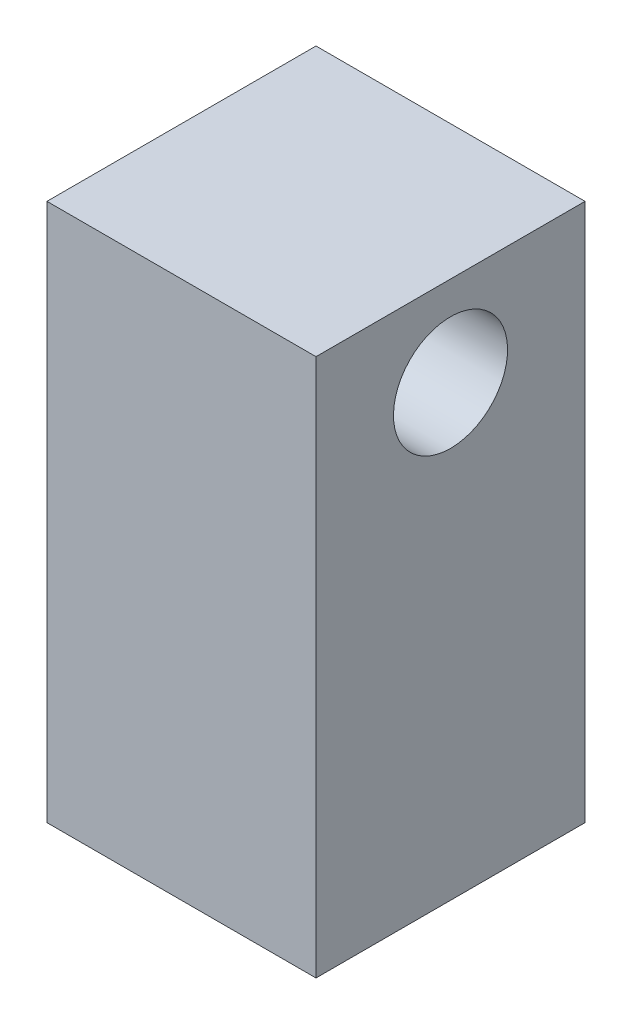
ISO-10303-21;
HEADER;
FILE_DESCRIPTION(('STEP AP214'),'2;1');
FILE_NAME('part.step','',(''),(''),'','','');
FILE_SCHEMA(('AUTOMOTIVE_DESIGN { 1 0 10303 214 1 1 1 1 }'));
ENDSEC;
DATA;
#1=APPLICATION_CONTEXT('core data for automotive mechanical design processes');
#2=APPLICATION_PROTOCOL_DEFINITION('international standard','automotive_design',2000,#1);
#3=PRODUCT_CONTEXT('',#1,'mechanical');
#4=PRODUCT('Part','Part','',(#3));
#5=PRODUCT_RELATED_PRODUCT_CATEGORY('part','',(#4));
#6=PRODUCT_DEFINITION_FORMATION('','',#4);
#7=PRODUCT_DEFINITION_CONTEXT('part definition',#1,'design');
#8=PRODUCT_DEFINITION('design','',#6,#7);
#9=PRODUCT_DEFINITION_SHAPE('','',#8);
#10=(LENGTH_UNIT() NAMED_UNIT(*) SI_UNIT(.MILLI.,.METRE.));
#11=(NAMED_UNIT(*) PLANE_ANGLE_UNIT() SI_UNIT($,.RADIAN.));
#12=(NAMED_UNIT(*) SI_UNIT($,.STERADIAN.) SOLID_ANGLE_UNIT());
#13=UNCERTAINTY_MEASURE_WITH_UNIT(LENGTH_MEASURE(1.E-05),#10,'distance_accuracy_value','');
#14=(GEOMETRIC_REPRESENTATION_CONTEXT(3) GLOBAL_UNCERTAINTY_ASSIGNED_CONTEXT((#13)) GLOBAL_UNIT_ASSIGNED_CONTEXT((#10,
#11,#12)) REPRESENTATION_CONTEXT('',''));
#15=CARTESIAN_POINT('',(0.,0.,0.));
#16=DIRECTION('',(0.,0.,1.));
#17=DIRECTION('',(1.,0.,0.));
#18=AXIS2_PLACEMENT_3D('',#15,#16,#17);
#19=CARTESIAN_POINT('',(4.7625,9.525,9.525));
#20=DIRECTION('',(-1.,0.,0.));
#21=DIRECTION('',(0.,-1.,0.));
#22=AXIS2_PLACEMENT_3D('',#19,#20,#21);
#23=PLANE('',#22);
#24=CARTESIAN_POINT('',(4.7625,6.35,4.7625));
#25=DIRECTION('',(-1.,0.,0.));
#26=DIRECTION('',(0.,-1.,0.));
#27=AXIS2_PLACEMENT_3D('',#24,#25,#26);
#28=CIRCLE('',#27,2.0193);
#29=CARTESIAN_POINT('',(4.7625,4.3307,4.7625));
#30=VERTEX_POINT('',#29);
#31=EDGE_CURVE('E132',#30,#30,#28,.T.);
#32=ORIENTED_EDGE('',*,*,#31,.T.);
#33=EDGE_LOOP('',(#32));
#34=FACE_BOUND('',#33,.T.);
#35=DIRECTION('',(0.,1.,0.));
#36=VECTOR('',#35,1.);
#37=CARTESIAN_POINT('',(4.7625,9.525,0.));
#38=LINE('',#37,#36);
#39=CARTESIAN_POINT('',(4.7625,-9.525,0.));
#40=VERTEX_POINT('',#39);
#41=CARTESIAN_POINT('',(4.7625,9.525,0.));
#42=VERTEX_POINT('',#41);
#43=EDGE_CURVE('E107',#40,#42,#38,.T.);
#44=ORIENTED_EDGE('',*,*,#43,.T.);
#45=DIRECTION('',(0.,0.,-1.));
#46=VECTOR('',#45,1.);
#47=CARTESIAN_POINT('',(4.7625,9.525,9.525));
#48=LINE('',#47,#46);
#49=CARTESIAN_POINT('',(4.7625,9.525,9.525));
#50=VERTEX_POINT('',#49);
#51=EDGE_CURVE('E11',#50,#42,#48,.T.);
#52=ORIENTED_EDGE('',*,*,#51,.F.);
#53=DIRECTION('',(0.,1.,0.));
#54=VECTOR('',#53,1.);
#55=CARTESIAN_POINT('',(4.7625,9.525,9.525));
#56=LINE('',#55,#54);
#57=CARTESIAN_POINT('',(4.7625,-9.525,9.525));
#58=VERTEX_POINT('',#57);
#59=EDGE_CURVE('E91',#58,#50,#56,.T.);
#60=ORIENTED_EDGE('',*,*,#59,.F.);
#61=DIRECTION('',(0.,0.,-1.));
#62=VECTOR('',#61,1.);
#63=CARTESIAN_POINT('',(4.7625,-9.525,9.525));
#64=LINE('',#63,#62);
#65=EDGE_CURVE('E103',#58,#40,#64,.T.);
#66=ORIENTED_EDGE('',*,*,#65,.T.);
#67=EDGE_LOOP('',(#44,#52,#60,#66));
#68=FACE_BOUND('',#67,.T.);
#69=ADVANCED_FACE('F39',(#34,#68),#23,.F.);
#70=CARTESIAN_POINT('',(-4.7625,9.525,9.525));
#71=DIRECTION('',(0.,-1.,0.));
#72=DIRECTION('',(0.,0.,-1.));
#73=AXIS2_PLACEMENT_3D('',#70,#71,#72);
#74=PLANE('',#73);
#75=DIRECTION('',(-1.,0.,0.));
#76=VECTOR('',#75,1.);
#77=CARTESIAN_POINT('',(-4.7625,9.525,0.));
#78=LINE('',#77,#76);
#79=CARTESIAN_POINT('',(-4.7625,9.525,0.));
#80=VERTEX_POINT('',#79);
#81=EDGE_CURVE('E96',#42,#80,#78,.T.);
#82=ORIENTED_EDGE('',*,*,#81,.T.);
#83=DIRECTION('',(0.,0.,-1.));
#84=VECTOR('',#83,1.);
#85=CARTESIAN_POINT('',(-4.7625,9.525,9.525));
#86=LINE('',#85,#84);
#87=CARTESIAN_POINT('',(-4.7625,9.525,9.525));
#88=VERTEX_POINT('',#87);
#89=EDGE_CURVE('E48',#88,#80,#86,.T.);
#90=ORIENTED_EDGE('',*,*,#89,.F.);
#91=DIRECTION('',(-1.,0.,0.));
#92=VECTOR('',#91,1.);
#93=CARTESIAN_POINT('',(-4.7625,9.525,9.525));
#94=LINE('',#93,#92);
#95=EDGE_CURVE('E86',#50,#88,#94,.T.);
#96=ORIENTED_EDGE('',*,*,#95,.F.);
#97=ORIENTED_EDGE('',*,*,#51,.T.);
#98=EDGE_LOOP('',(#82,#90,#96,#97));
#99=FACE_BOUND('',#98,.T.);
#100=ADVANCED_FACE('F95',(#99),#74,.F.);
#101=CARTESIAN_POINT('',(-4.7625,9.525,9.525));
#102=DIRECTION('',(1.,0.,0.));
#103=DIRECTION('',(0.,1.,0.));
#104=AXIS2_PLACEMENT_3D('',#101,#102,#103);
#105=PLANE('',#104);
#106=CARTESIAN_POINT('',(-4.7625,6.35,4.7625));
#107=DIRECTION('',(-1.,0.,0.));
#108=DIRECTION('',(0.,-1.,0.));
#109=AXIS2_PLACEMENT_3D('',#106,#107,#108);
#110=CIRCLE('',#109,2.0193);
#111=CARTESIAN_POINT('',(-4.7625,4.3307,4.7625));
#112=VERTEX_POINT('',#111);
#113=EDGE_CURVE('E136',#112,#112,#110,.T.);
#114=ORIENTED_EDGE('',*,*,#113,.F.);
#115=EDGE_LOOP('',(#114));
#116=FACE_BOUND('',#115,.T.);
#117=DIRECTION('',(0.,-1.,0.));
#118=VECTOR('',#117,1.);
#119=CARTESIAN_POINT('',(-4.7625,9.525,0.));
#120=LINE('',#119,#118);
#121=CARTESIAN_POINT('',(-4.7625,-9.525,0.));
#122=VERTEX_POINT('',#121);
#123=EDGE_CURVE('E73',#80,#122,#120,.T.);
#124=ORIENTED_EDGE('',*,*,#123,.T.);
#125=DIRECTION('',(0.,0.,-1.));
#126=VECTOR('',#125,1.);
#127=CARTESIAN_POINT('',(-4.7625,-9.525,9.525));
#128=LINE('',#127,#126);
#129=CARTESIAN_POINT('',(-4.7625,-9.525,9.525));
#130=VERTEX_POINT('',#129);
#131=EDGE_CURVE('E98',#130,#122,#128,.T.);
#132=ORIENTED_EDGE('',*,*,#131,.F.);
#133=DIRECTION('',(0.,-1.,0.));
#134=VECTOR('',#133,1.);
#135=CARTESIAN_POINT('',(-4.7625,9.525,9.525));
#136=LINE('',#135,#134);
#137=EDGE_CURVE('E89',#88,#130,#136,.T.);
#138=ORIENTED_EDGE('',*,*,#137,.F.);
#139=ORIENTED_EDGE('',*,*,#89,.T.);
#140=EDGE_LOOP('',(#124,#132,#138,#139));
#141=FACE_BOUND('',#140,.T.);
#142=ADVANCED_FACE('F99',(#116,#141),#105,.F.);
#143=CARTESIAN_POINT('',(-4.7625,-9.525,9.525));
#144=DIRECTION('',(0.,1.,0.));
#145=DIRECTION('',(0.,0.,1.));
#146=AXIS2_PLACEMENT_3D('',#143,#144,#145);
#147=PLANE('',#146);
#148=CARTESIAN_POINT('',(0.,-9.525,4.7625));
#149=DIRECTION('',(0.,-1.,0.));
#150=DIRECTION('',(0.,0.,-1.));
#151=AXIS2_PLACEMENT_3D('',#148,#149,#150);
#152=CIRCLE('',#151,1.28905);
#153=CARTESIAN_POINT('',(0.,-9.525,3.47345));
#154=VERTEX_POINT('',#153);
#155=EDGE_CURVE('E128',#154,#154,#152,.T.);
#156=ORIENTED_EDGE('',*,*,#155,.F.);
#157=EDGE_LOOP('',(#156));
#158=FACE_BOUND('',#157,.T.);
#159=DIRECTION('',(1.,0.,0.));
#160=VECTOR('',#159,1.);
#161=CARTESIAN_POINT('',(-4.7625,-9.525,0.));
#162=LINE('',#161,#160);
#163=EDGE_CURVE('E79',#122,#40,#162,.T.);
#164=ORIENTED_EDGE('',*,*,#163,.T.);
#165=ORIENTED_EDGE('',*,*,#65,.F.);
#166=DIRECTION('',(1.,0.,0.));
#167=VECTOR('',#166,1.);
#168=CARTESIAN_POINT('',(-4.7625,-9.525,9.525));
#169=LINE('',#168,#167);
#170=EDGE_CURVE('E56',#130,#58,#169,.T.);
#171=ORIENTED_EDGE('',*,*,#170,.F.);
#172=ORIENTED_EDGE('',*,*,#131,.T.);
#173=EDGE_LOOP('',(#164,#165,#171,#172));
#174=FACE_BOUND('',#173,.T.);
#175=ADVANCED_FACE('F121',(#158,#174),#147,.F.);
#176=CARTESIAN_POINT('',(0.,0.,9.525));
#177=DIRECTION('',(0.,0.,1.));
#178=DIRECTION('',(1.,0.,0.));
#179=AXIS2_PLACEMENT_3D('',#176,#177,#178);
#180=PLANE('',#179);
#181=ORIENTED_EDGE('',*,*,#59,.T.);
#182=ORIENTED_EDGE('',*,*,#95,.T.);
#183=ORIENTED_EDGE('',*,*,#137,.T.);
#184=ORIENTED_EDGE('',*,*,#170,.T.);
#185=EDGE_LOOP('',(#181,#182,#183,#184));
#186=FACE_BOUND('',#185,.T.);
#187=ADVANCED_FACE('F87',(#186),#180,.T.);
#188=CARTESIAN_POINT('',(0.,0.,0.));
#189=DIRECTION('',(0.,0.,1.));
#190=DIRECTION('',(1.,0.,0.));
#191=AXIS2_PLACEMENT_3D('',#188,#189,#190);
#192=PLANE('',#191);
#193=ORIENTED_EDGE('',*,*,#43,.F.);
#194=ORIENTED_EDGE('',*,*,#163,.F.);
#195=ORIENTED_EDGE('',*,*,#123,.F.);
#196=ORIENTED_EDGE('',*,*,#81,.F.);
#197=EDGE_LOOP('',(#193,#194,#195,#196));
#198=FACE_BOUND('',#197,.T.);
#199=ADVANCED_FACE('F124',(#198),#192,.F.);
#200=CARTESIAN_POINT('',(0.,3.175,4.7625));
#201=DIRECTION('',(0.,-1.,0.));
#202=DIRECTION('',(0.,0.,-1.));
#203=AXIS2_PLACEMENT_3D('',#200,#201,#202);
#204=CYLINDRICAL_SURFACE('',#203,1.28905);
#205=CARTESIAN_POINT('',(0.,3.175,4.7625));
#206=DIRECTION('',(0.,-1.,0.));
#207=DIRECTION('',(0.,0.,-1.));
#208=AXIS2_PLACEMENT_3D('',#205,#206,#207);
#209=CIRCLE('',#208,1.28905);
#210=CARTESIAN_POINT('',(0.,3.175,3.47345));
#211=VERTEX_POINT('',#210);
#212=EDGE_CURVE('E111',#211,#211,#209,.T.);
#213=ORIENTED_EDGE('',*,*,#212,.F.);
#214=EDGE_LOOP('',(#213));
#215=FACE_BOUND('',#214,.T.);
#216=ORIENTED_EDGE('',*,*,#155,.T.);
#217=EDGE_LOOP('',(#216));
#218=FACE_BOUND('',#217,.T.);
#219=ADVANCED_FACE('F187',(#215,#218),#204,.F.);
#220=CARTESIAN_POINT('',(0.,3.175,4.7625));
#221=DIRECTION('',(0.,-1.,0.));
#222=DIRECTION('',(0.,0.,-1.));
#223=AXIS2_PLACEMENT_3D('',#220,#221,#222);
#224=PLANE('',#223);
#225=ORIENTED_EDGE('',*,*,#212,.T.);
#226=EDGE_LOOP('',(#225));
#227=FACE_BOUND('',#226,.T.);
#228=ADVANCED_FACE('F148',(#227),#224,.T.);
#229=CARTESIAN_POINT('',(4.7625,6.35,4.7625));
#230=DIRECTION('',(-1.,0.,0.));
#231=DIRECTION('',(0.,-1.,0.));
#232=AXIS2_PLACEMENT_3D('',#229,#230,#231);
#233=CYLINDRICAL_SURFACE('',#232,2.0193);
#234=ORIENTED_EDGE('',*,*,#31,.F.);
#235=EDGE_LOOP('',(#234));
#236=FACE_BOUND('',#235,.T.);
#237=ORIENTED_EDGE('',*,*,#113,.T.);
#238=EDGE_LOOP('',(#237));
#239=FACE_BOUND('',#238,.T.);
#240=ADVANCED_FACE('F145',(#236,#239),#233,.F.);
#241=CLOSED_SHELL('',(#69,#100,#142,#175,#187,#199,#219,#228,#240));
#242=MANIFOLD_SOLID_BREP('B2',#241);
#243=ADVANCED_BREP_SHAPE_REPRESENTATION('',(#18,#242),#14);
#244=SHAPE_DEFINITION_REPRESENTATION(#9,#243);
ENDSEC;
END-ISO-10303-21;
